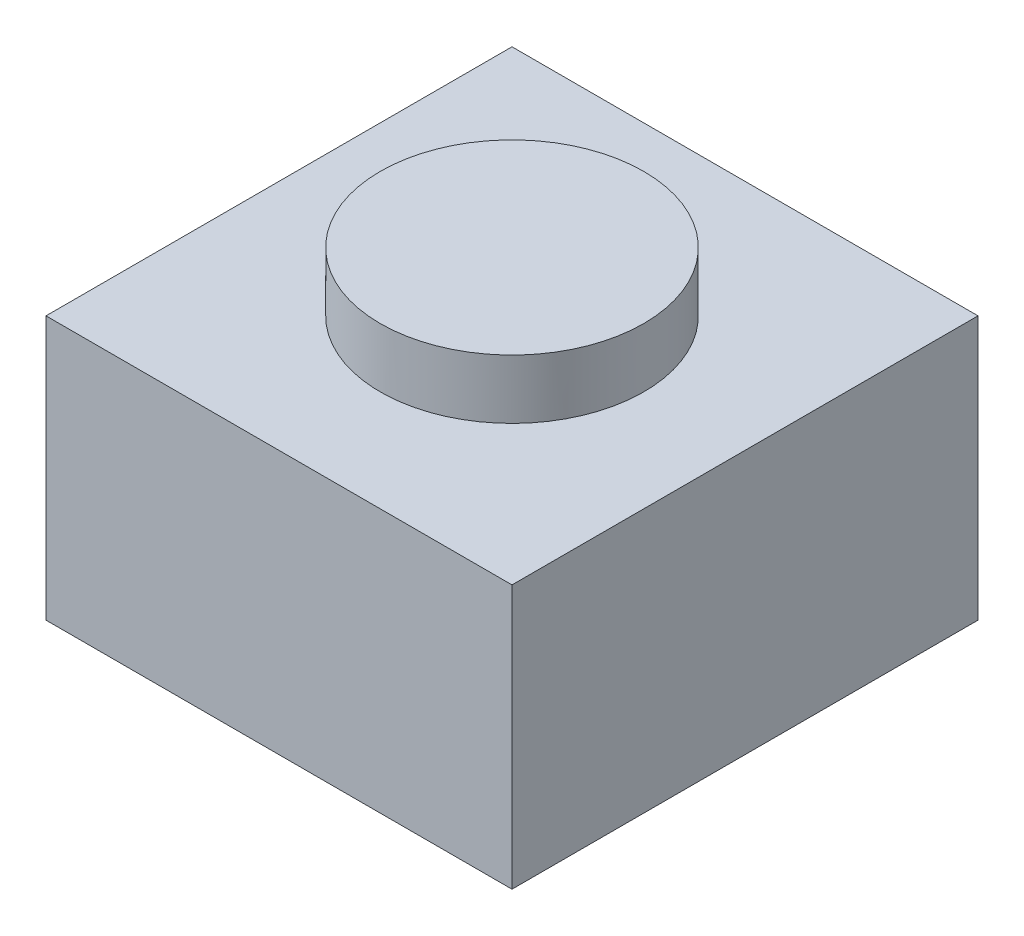
ISO-10303-21;
HEADER;
FILE_DESCRIPTION(('STEP AP214'),'2;1');
FILE_NAME('part.step','',(''),(''),'','','');
FILE_SCHEMA(('AUTOMOTIVE_DESIGN { 1 0 10303 214 1 1 1 1 }'));
ENDSEC;
DATA;
#1=APPLICATION_CONTEXT('core data for automotive mechanical design processes');
#2=APPLICATION_PROTOCOL_DEFINITION('international standard','automotive_design',2000,#1);
#3=PRODUCT_CONTEXT('',#1,'mechanical');
#4=PRODUCT('Part','Part','',(#3));
#5=PRODUCT_RELATED_PRODUCT_CATEGORY('part','',(#4));
#6=PRODUCT_DEFINITION_FORMATION('','',#4);
#7=PRODUCT_DEFINITION_CONTEXT('part definition',#1,'design');
#8=PRODUCT_DEFINITION('design','',#6,#7);
#9=PRODUCT_DEFINITION_SHAPE('','',#8);
#10=(LENGTH_UNIT() NAMED_UNIT(*) SI_UNIT(.MILLI.,.METRE.));
#11=(NAMED_UNIT(*) PLANE_ANGLE_UNIT() SI_UNIT($,.RADIAN.));
#12=(NAMED_UNIT(*) SI_UNIT($,.STERADIAN.) SOLID_ANGLE_UNIT());
#13=UNCERTAINTY_MEASURE_WITH_UNIT(LENGTH_MEASURE(1.E-05),#10,'distance_accuracy_value','');
#14=(GEOMETRIC_REPRESENTATION_CONTEXT(3) GLOBAL_UNCERTAINTY_ASSIGNED_CONTEXT((#13)) GLOBAL_UNIT_ASSIGNED_CONTEXT((#10,
#11,#12)) REPRESENTATION_CONTEXT('',''));
#15=CARTESIAN_POINT('',(0.,0.,0.));
#16=DIRECTION('',(0.,0.,1.));
#17=DIRECTION('',(1.,0.,0.));
#18=AXIS2_PLACEMENT_3D('',#15,#16,#17);
#19=CARTESIAN_POINT('',(0.,3.5052,0.));
#20=DIRECTION('',(0.,-1.,0.));
#21=DIRECTION('',(0.,0.,-1.));
#22=AXIS2_PLACEMENT_3D('',#19,#20,#21);
#23=PLANE('',#22);
#24=DIRECTION('',(0.,0.,1.));
#25=VECTOR('',#24,1.);
#26=CARTESIAN_POINT('',(0.,3.5052,0.));
#27=LINE('',#26,#25);
#28=CARTESIAN_POINT('',(0.,3.5052,-6.1976));
#29=VERTEX_POINT('',#28);
#30=CARTESIAN_POINT('',(0.,3.5052,0.));
#31=VERTEX_POINT('',#30);
#32=EDGE_CURVE('E86',#29,#31,#27,.T.);
#33=ORIENTED_EDGE('',*,*,#32,.T.);
#34=DIRECTION('',(1.,0.,0.));
#35=VECTOR('',#34,1.);
#36=CARTESIAN_POINT('',(0.,3.5052,0.));
#37=LINE('',#36,#35);
#38=CARTESIAN_POINT('',(6.1976,3.5052,0.));
#39=VERTEX_POINT('',#38);
#40=EDGE_CURVE('E81',#31,#39,#37,.T.);
#41=ORIENTED_EDGE('',*,*,#40,.T.);
#42=DIRECTION('',(0.,0.,-1.));
#43=VECTOR('',#42,1.);
#44=CARTESIAN_POINT('',(6.1976,3.5052,0.));
#45=LINE('',#44,#43);
#46=CARTESIAN_POINT('',(6.1976,3.5052,-6.1976));
#47=VERTEX_POINT('',#46);
#48=EDGE_CURVE('E84',#39,#47,#45,.T.);
#49=ORIENTED_EDGE('',*,*,#48,.T.);
#50=DIRECTION('',(-1.,0.,0.));
#51=VECTOR('',#50,1.);
#52=CARTESIAN_POINT('',(0.,3.5052,-6.1976));
#53=LINE('',#52,#51);
#54=EDGE_CURVE('E50',#47,#29,#53,.T.);
#55=ORIENTED_EDGE('',*,*,#54,.T.);
#56=EDGE_LOOP('',(#33,#41,#49,#55));
#57=FACE_BOUND('',#56,.T.);
#58=CARTESIAN_POINT('',(3.0988,3.5052,-3.0988));
#59=DIRECTION('',(0.,-1.,0.));
#60=DIRECTION('',(0.,0.,-1.));
#61=AXIS2_PLACEMENT_3D('',#58,#59,#60);
#62=CIRCLE('',#61,1.7526);
#63=CARTESIAN_POINT('',(3.0988,3.5052,-4.8514));
#64=VERTEX_POINT('',#63);
#65=EDGE_CURVE('E11',#64,#64,#62,.F.);
#66=ORIENTED_EDGE('',*,*,#65,.F.);
#67=EDGE_LOOP('',(#66));
#68=FACE_BOUND('',#67,.T.);
#69=ADVANCED_FACE('F33',(#57,#68),#23,.F.);
#70=CARTESIAN_POINT('',(0.,3.5052,0.));
#71=DIRECTION('',(1.,0.,0.));
#72=DIRECTION('',(0.,0.,-1.));
#73=AXIS2_PLACEMENT_3D('',#70,#71,#72);
#74=PLANE('',#73);
#75=DIRECTION('',(0.,0.,1.));
#76=VECTOR('',#75,1.);
#77=CARTESIAN_POINT('',(0.,0.,0.));
#78=LINE('',#77,#76);
#79=CARTESIAN_POINT('',(0.,0.,-6.1976));
#80=VERTEX_POINT('',#79);
#81=CARTESIAN_POINT('',(0.,0.,0.));
#82=VERTEX_POINT('',#81);
#83=EDGE_CURVE('E100',#80,#82,#78,.T.);
#84=ORIENTED_EDGE('',*,*,#83,.T.);
#85=DIRECTION('',(0.,-1.,0.));
#86=VECTOR('',#85,1.);
#87=CARTESIAN_POINT('',(0.,3.5052,0.));
#88=LINE('',#87,#86);
#89=EDGE_CURVE('E42',#31,#82,#88,.T.);
#90=ORIENTED_EDGE('',*,*,#89,.F.);
#91=ORIENTED_EDGE('',*,*,#32,.F.);
#92=DIRECTION('',(0.,-1.,0.));
#93=VECTOR('',#92,1.);
#94=CARTESIAN_POINT('',(0.,3.5052,-6.1976));
#95=LINE('',#94,#93);
#96=EDGE_CURVE('E96',#29,#80,#95,.T.);
#97=ORIENTED_EDGE('',*,*,#96,.T.);
#98=EDGE_LOOP('',(#84,#90,#91,#97));
#99=FACE_BOUND('',#98,.T.);
#100=ADVANCED_FACE('F35',(#99),#74,.F.);
#101=CARTESIAN_POINT('',(0.,3.5052,0.));
#102=DIRECTION('',(0.,0.,-1.));
#103=DIRECTION('',(-1.,0.,0.));
#104=AXIS2_PLACEMENT_3D('',#101,#102,#103);
#105=PLANE('',#104);
#106=DIRECTION('',(1.,0.,0.));
#107=VECTOR('',#106,1.);
#108=CARTESIAN_POINT('',(0.,0.,0.));
#109=LINE('',#108,#107);
#110=CARTESIAN_POINT('',(6.1976,0.,0.));
#111=VERTEX_POINT('',#110);
#112=EDGE_CURVE('E91',#82,#111,#109,.T.);
#113=ORIENTED_EDGE('',*,*,#112,.T.);
#114=DIRECTION('',(0.,-1.,0.));
#115=VECTOR('',#114,1.);
#116=CARTESIAN_POINT('',(6.1976,3.5052,0.));
#117=LINE('',#116,#115);
#118=EDGE_CURVE('E89',#39,#111,#117,.T.);
#119=ORIENTED_EDGE('',*,*,#118,.F.);
#120=ORIENTED_EDGE('',*,*,#40,.F.);
#121=ORIENTED_EDGE('',*,*,#89,.T.);
#122=EDGE_LOOP('',(#113,#119,#120,#121));
#123=FACE_BOUND('',#122,.T.);
#124=ADVANCED_FACE('F90',(#123),#105,.F.);
#125=CARTESIAN_POINT('',(6.1976,3.5052,0.));
#126=DIRECTION('',(-1.,0.,0.));
#127=DIRECTION('',(0.,0.,1.));
#128=AXIS2_PLACEMENT_3D('',#125,#126,#127);
#129=PLANE('',#128);
#130=DIRECTION('',(0.,0.,-1.));
#131=VECTOR('',#130,1.);
#132=CARTESIAN_POINT('',(6.1976,0.,0.));
#133=LINE('',#132,#131);
#134=CARTESIAN_POINT('',(6.1976,0.,-6.1976));
#135=VERTEX_POINT('',#134);
#136=EDGE_CURVE('E67',#111,#135,#133,.T.);
#137=ORIENTED_EDGE('',*,*,#136,.T.);
#138=DIRECTION('',(0.,-1.,0.));
#139=VECTOR('',#138,1.);
#140=CARTESIAN_POINT('',(6.1976,3.5052,-6.1976));
#141=LINE('',#140,#139);
#142=EDGE_CURVE('E92',#47,#135,#141,.T.);
#143=ORIENTED_EDGE('',*,*,#142,.F.);
#144=ORIENTED_EDGE('',*,*,#48,.F.);
#145=ORIENTED_EDGE('',*,*,#118,.T.);
#146=EDGE_LOOP('',(#137,#143,#144,#145));
#147=FACE_BOUND('',#146,.T.);
#148=ADVANCED_FACE('F94',(#147),#129,.F.);
#149=CARTESIAN_POINT('',(0.,3.5052,-6.1976));
#150=DIRECTION('',(0.,0.,1.));
#151=DIRECTION('',(1.,0.,0.));
#152=AXIS2_PLACEMENT_3D('',#149,#150,#151);
#153=PLANE('',#152);
#154=DIRECTION('',(-1.,0.,0.));
#155=VECTOR('',#154,1.);
#156=CARTESIAN_POINT('',(0.,0.,-6.1976));
#157=LINE('',#156,#155);
#158=EDGE_CURVE('E73',#135,#80,#157,.T.);
#159=ORIENTED_EDGE('',*,*,#158,.T.);
#160=ORIENTED_EDGE('',*,*,#96,.F.);
#161=ORIENTED_EDGE('',*,*,#54,.F.);
#162=ORIENTED_EDGE('',*,*,#142,.T.);
#163=EDGE_LOOP('',(#159,#160,#161,#162));
#164=FACE_BOUND('',#163,.T.);
#165=ADVANCED_FACE('F114',(#164),#153,.F.);
#166=CARTESIAN_POINT('',(0.,0.,0.));
#167=DIRECTION('',(0.,-1.,0.));
#168=DIRECTION('',(0.,0.,-1.));
#169=AXIS2_PLACEMENT_3D('',#166,#167,#168);
#170=PLANE('',#169);
#171=ORIENTED_EDGE('',*,*,#83,.F.);
#172=ORIENTED_EDGE('',*,*,#158,.F.);
#173=ORIENTED_EDGE('',*,*,#136,.F.);
#174=ORIENTED_EDGE('',*,*,#112,.F.);
#175=EDGE_LOOP('',(#171,#172,#173,#174));
#176=FACE_BOUND('',#175,.T.);
#177=ADVANCED_FACE('F111',(#176),#170,.T.);
#178=CARTESIAN_POINT('',(3.0988,4.2926,-3.0988));
#179=DIRECTION('',(0.,-1.,0.));
#180=DIRECTION('',(0.,0.,-1.));
#181=AXIS2_PLACEMENT_3D('',#178,#179,#180);
#182=CYLINDRICAL_SURFACE('',#181,1.7526);
#183=CARTESIAN_POINT('',(3.0988,4.2926,-3.0988));
#184=DIRECTION('',(0.,1.,0.));
#185=DIRECTION('',(0.,0.,1.));
#186=AXIS2_PLACEMENT_3D('',#183,#184,#185);
#187=CIRCLE('',#186,1.7526);
#188=CARTESIAN_POINT('',(3.0988,4.2926,-1.3462));
#189=VERTEX_POINT('',#188);
#190=EDGE_CURVE('E103',#189,#189,#187,.T.);
#191=ORIENTED_EDGE('',*,*,#190,.F.);
#192=EDGE_LOOP('',(#191));
#193=FACE_BOUND('',#192,.T.);
#194=ORIENTED_EDGE('',*,*,#65,.T.);
#195=EDGE_LOOP('',(#194));
#196=FACE_BOUND('',#195,.T.);
#197=ADVANCED_FACE('F113',(#193,#196),#182,.T.);
#198=CARTESIAN_POINT('',(3.0988,4.2926,-3.0988));
#199=DIRECTION('',(0.,1.,0.));
#200=DIRECTION('',(0.,0.,1.));
#201=AXIS2_PLACEMENT_3D('',#198,#199,#200);
#202=PLANE('',#201);
#203=ORIENTED_EDGE('',*,*,#190,.T.);
#204=EDGE_LOOP('',(#203));
#205=FACE_BOUND('',#204,.T.);
#206=ADVANCED_FACE('F120',(#205),#202,.T.);
#207=CLOSED_SHELL('',(#69,#100,#124,#148,#165,#177,#197,#206));
#208=MANIFOLD_SOLID_BREP('B2',#207);
#209=ADVANCED_BREP_SHAPE_REPRESENTATION('',(#18,#208),#14);
#210=SHAPE_DEFINITION_REPRESENTATION(#9,#209);
ENDSEC;
END-ISO-10303-21;
